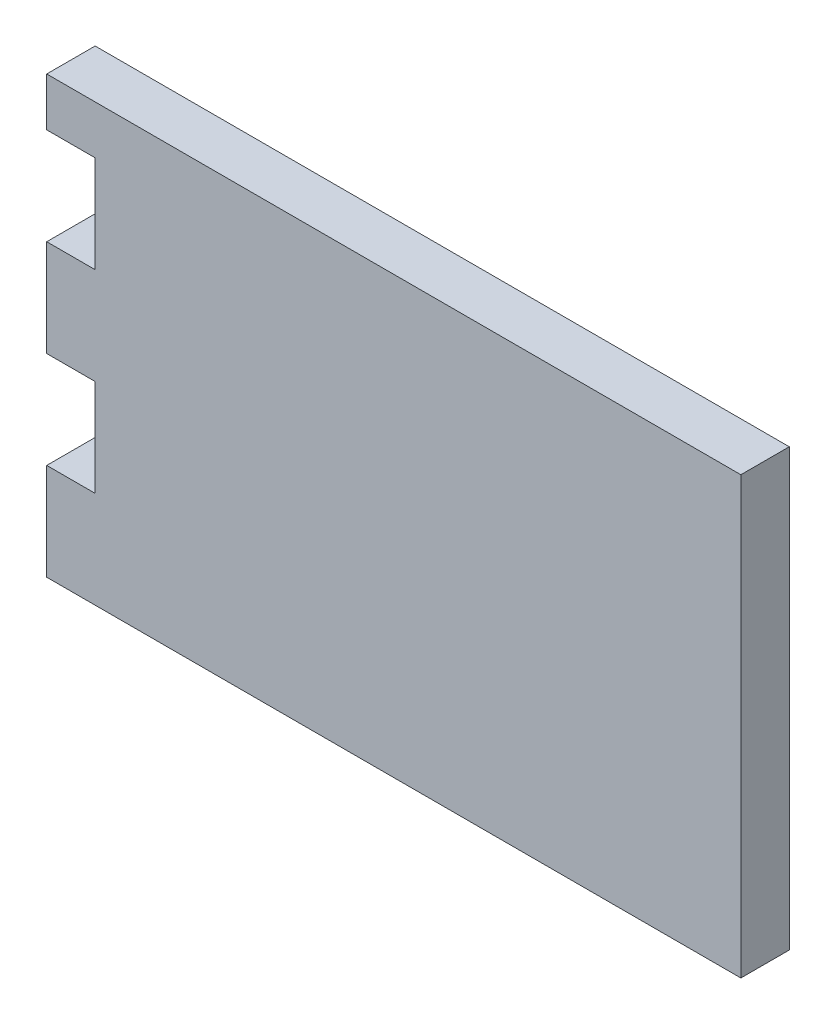
ISO-10303-21;
HEADER;
FILE_DESCRIPTION(('STEP AP214'),'2;1');
FILE_NAME('part.step','',(''),(''),'','','');
FILE_SCHEMA(('AUTOMOTIVE_DESIGN { 1 0 10303 214 1 1 1 1 }'));
ENDSEC;
DATA;
#1=APPLICATION_CONTEXT('core data for automotive mechanical design processes');
#2=APPLICATION_PROTOCOL_DEFINITION('international standard','automotive_design',2000,#1);
#3=PRODUCT_CONTEXT('',#1,'mechanical');
#4=PRODUCT('Part','Part','',(#3));
#5=PRODUCT_RELATED_PRODUCT_CATEGORY('part','',(#4));
#6=PRODUCT_DEFINITION_FORMATION('','',#4);
#7=PRODUCT_DEFINITION_CONTEXT('part definition',#1,'design');
#8=PRODUCT_DEFINITION('design','',#6,#7);
#9=PRODUCT_DEFINITION_SHAPE('','',#8);
#10=(LENGTH_UNIT() NAMED_UNIT(*) SI_UNIT(.MILLI.,.METRE.));
#11=(NAMED_UNIT(*) PLANE_ANGLE_UNIT() SI_UNIT($,.RADIAN.));
#12=(NAMED_UNIT(*) SI_UNIT($,.STERADIAN.) SOLID_ANGLE_UNIT());
#13=UNCERTAINTY_MEASURE_WITH_UNIT(LENGTH_MEASURE(1.E-05),#10,'distance_accuracy_value','');
#14=(GEOMETRIC_REPRESENTATION_CONTEXT(3) GLOBAL_UNCERTAINTY_ASSIGNED_CONTEXT((#13)) GLOBAL_UNIT_ASSIGNED_CONTEXT((#10,
#11,#12)) REPRESENTATION_CONTEXT('',''));
#15=CARTESIAN_POINT('',(0.,0.,0.));
#16=DIRECTION('',(0.,0.,1.));
#17=DIRECTION('',(1.,0.,0.));
#18=AXIS2_PLACEMENT_3D('',#15,#16,#17);
#19=CARTESIAN_POINT('',(0.,-18.,6.));
#20=DIRECTION('',(0.,1.,0.));
#21=DIRECTION('',(0.,0.,1.));
#22=AXIS2_PLACEMENT_3D('',#19,#20,#21);
#23=PLANE('',#22);
#24=DIRECTION('',(1.,0.,0.));
#25=VECTOR('',#24,1.);
#26=CARTESIAN_POINT('',(0.,-18.,0.));
#27=LINE('',#26,#25);
#28=CARTESIAN_POINT('',(0.,-18.,0.));
#29=VERTEX_POINT('',#28);
#30=CARTESIAN_POINT('',(5.99999999999984,-18.,0.));
#31=VERTEX_POINT('',#30);
#32=EDGE_CURVE('E166',#29,#31,#27,.T.);
#33=ORIENTED_EDGE('',*,*,#32,.F.);
#34=DIRECTION('',(0.,0.,-1.));
#35=VECTOR('',#34,1.);
#36=CARTESIAN_POINT('',(0.,-18.,6.));
#37=LINE('',#36,#35);
#38=CARTESIAN_POINT('',(0.,-18.,6.));
#39=VERTEX_POINT('',#38);
#40=EDGE_CURVE('E11',#39,#29,#37,.T.);
#41=ORIENTED_EDGE('',*,*,#40,.F.);
#42=DIRECTION('',(1.,0.,0.));
#43=VECTOR('',#42,1.);
#44=CARTESIAN_POINT('',(0.,-18.,6.));
#45=LINE('',#44,#43);
#46=CARTESIAN_POINT('',(5.99999999999984,-18.,6.));
#47=VERTEX_POINT('',#46);
#48=EDGE_CURVE('E202',#39,#47,#45,.T.);
#49=ORIENTED_EDGE('',*,*,#48,.T.);
#50=DIRECTION('',(0.,0.,-1.));
#51=VECTOR('',#50,1.);
#52=CARTESIAN_POINT('',(5.99999999999984,-18.,6.));
#53=LINE('',#52,#51);
#54=EDGE_CURVE('E105',#47,#31,#53,.T.);
#55=ORIENTED_EDGE('',*,*,#54,.T.);
#56=EDGE_LOOP('',(#33,#41,#49,#55));
#57=FACE_BOUND('',#56,.T.);
#58=ADVANCED_FACE('F41',(#57),#23,.T.);
#59=CARTESIAN_POINT('',(0.,0.,6.));
#60=DIRECTION('',(1.,0.,0.));
#61=DIRECTION('',(0.,1.,0.));
#62=AXIS2_PLACEMENT_3D('',#59,#60,#61);
#63=PLANE('',#62);
#64=DIRECTION('',(0.,-1.,0.));
#65=VECTOR('',#64,1.);
#66=CARTESIAN_POINT('',(0.,0.,0.));
#67=LINE('',#66,#65);
#68=CARTESIAN_POINT('',(0.,-30.,0.));
#69=VERTEX_POINT('',#68);
#70=EDGE_CURVE('E170',#29,#69,#67,.T.);
#71=ORIENTED_EDGE('',*,*,#70,.T.);
#72=DIRECTION('',(0.,0.,-1.));
#73=VECTOR('',#72,1.);
#74=CARTESIAN_POINT('',(0.,-30.,6.));
#75=LINE('',#74,#73);
#76=CARTESIAN_POINT('',(0.,-30.,6.));
#77=VERTEX_POINT('',#76);
#78=EDGE_CURVE('E50',#77,#69,#75,.T.);
#79=ORIENTED_EDGE('',*,*,#78,.F.);
#80=DIRECTION('',(0.,-1.,0.));
#81=VECTOR('',#80,1.);
#82=CARTESIAN_POINT('',(0.,0.,6.));
#83=LINE('',#82,#81);
#84=EDGE_CURVE('E149',#39,#77,#83,.T.);
#85=ORIENTED_EDGE('',*,*,#84,.F.);
#86=ORIENTED_EDGE('',*,*,#40,.T.);
#87=EDGE_LOOP('',(#71,#79,#85,#86));
#88=FACE_BOUND('',#87,.T.);
#89=ADVANCED_FACE('F288',(#88),#63,.F.);
#90=CARTESIAN_POINT('',(0.,-30.,6.));
#91=DIRECTION('',(0.,1.,0.));
#92=DIRECTION('',(0.,0.,1.));
#93=AXIS2_PLACEMENT_3D('',#90,#91,#92);
#94=PLANE('',#93);
#95=DIRECTION('',(1.,0.,0.));
#96=VECTOR('',#95,1.);
#97=CARTESIAN_POINT('',(0.,-30.,0.));
#98=LINE('',#97,#96);
#99=CARTESIAN_POINT('',(5.99999999999993,-30.,0.));
#100=VERTEX_POINT('',#99);
#101=EDGE_CURVE('E173',#69,#100,#98,.T.);
#102=ORIENTED_EDGE('',*,*,#101,.T.);
#103=DIRECTION('',(0.,0.,-1.));
#104=VECTOR('',#103,1.);
#105=CARTESIAN_POINT('',(5.99999999999993,-30.,6.));
#106=LINE('',#105,#104);
#107=CARTESIAN_POINT('',(5.99999999999993,-30.,6.));
#108=VERTEX_POINT('',#107);
#109=EDGE_CURVE('E225',#108,#100,#106,.T.);
#110=ORIENTED_EDGE('',*,*,#109,.F.);
#111=DIRECTION('',(1.,0.,0.));
#112=VECTOR('',#111,1.);
#113=CARTESIAN_POINT('',(0.,-30.,6.));
#114=LINE('',#113,#112);
#115=EDGE_CURVE('E236',#77,#108,#114,.T.);
#116=ORIENTED_EDGE('',*,*,#115,.F.);
#117=ORIENTED_EDGE('',*,*,#78,.T.);
#118=EDGE_LOOP('',(#102,#110,#116,#117));
#119=FACE_BOUND('',#118,.T.);
#120=ADVANCED_FACE('F234',(#119),#94,.F.);
#121=CARTESIAN_POINT('',(5.99999999999993,0.,6.));
#122=DIRECTION('',(1.,0.,0.));
#123=DIRECTION('',(0.,1.,0.));
#124=AXIS2_PLACEMENT_3D('',#121,#122,#123);
#125=PLANE('',#124);
#126=DIRECTION('',(0.,-1.,0.));
#127=VECTOR('',#126,1.);
#128=CARTESIAN_POINT('',(5.99999999999993,0.,0.));
#129=LINE('',#128,#127);
#130=CARTESIAN_POINT('',(5.99999999999992,-42.,0.));
#131=VERTEX_POINT('',#130);
#132=EDGE_CURVE('E177',#100,#131,#129,.T.);
#133=ORIENTED_EDGE('',*,*,#132,.T.);
#134=DIRECTION('',(0.,0.,-1.));
#135=VECTOR('',#134,1.);
#136=CARTESIAN_POINT('',(5.99999999999992,-42.,6.));
#137=LINE('',#136,#135);
#138=CARTESIAN_POINT('',(5.99999999999992,-42.,6.));
#139=VERTEX_POINT('',#138);
#140=EDGE_CURVE('E222',#139,#131,#137,.T.);
#141=ORIENTED_EDGE('',*,*,#140,.F.);
#142=DIRECTION('',(0.,-1.,0.));
#143=VECTOR('',#142,1.);
#144=CARTESIAN_POINT('',(5.99999999999993,0.,6.));
#145=LINE('',#144,#143);
#146=EDGE_CURVE('E249',#108,#139,#145,.T.);
#147=ORIENTED_EDGE('',*,*,#146,.F.);
#148=ORIENTED_EDGE('',*,*,#109,.T.);
#149=EDGE_LOOP('',(#133,#141,#147,#148));
#150=FACE_BOUND('',#149,.T.);
#151=ADVANCED_FACE('F246',(#150),#125,.F.);
#152=CARTESIAN_POINT('',(0.,-42.,6.));
#153=DIRECTION('',(0.,1.,0.));
#154=DIRECTION('',(0.,0.,1.));
#155=AXIS2_PLACEMENT_3D('',#152,#153,#154);
#156=PLANE('',#155);
#157=DIRECTION('',(1.,0.,0.));
#158=VECTOR('',#157,1.);
#159=CARTESIAN_POINT('',(0.,-42.,0.));
#160=LINE('',#159,#158);
#161=CARTESIAN_POINT('',(0.,-42.,0.));
#162=VERTEX_POINT('',#161);
#163=EDGE_CURVE('E181',#162,#131,#160,.T.);
#164=ORIENTED_EDGE('',*,*,#163,.F.);
#165=DIRECTION('',(0.,0.,-1.));
#166=VECTOR('',#165,1.);
#167=CARTESIAN_POINT('',(0.,-42.,6.));
#168=LINE('',#167,#166);
#169=CARTESIAN_POINT('',(0.,-42.,6.));
#170=VERTEX_POINT('',#169);
#171=EDGE_CURVE('E219',#170,#162,#168,.T.);
#172=ORIENTED_EDGE('',*,*,#171,.F.);
#173=DIRECTION('',(1.,0.,0.));
#174=VECTOR('',#173,1.);
#175=CARTESIAN_POINT('',(0.,-42.,6.));
#176=LINE('',#175,#174);
#177=EDGE_CURVE('E252',#170,#139,#176,.T.);
#178=ORIENTED_EDGE('',*,*,#177,.T.);
#179=ORIENTED_EDGE('',*,*,#140,.T.);
#180=EDGE_LOOP('',(#164,#172,#178,#179));
#181=FACE_BOUND('',#180,.T.);
#182=ADVANCED_FACE('F299',(#181),#156,.T.);
#183=CARTESIAN_POINT('',(0.,-54.,0.));
#184=VERTEX_POINT('',#183);
#185=EDGE_CURVE('E174',#162,#184,#67,.T.);
#186=ORIENTED_EDGE('',*,*,#185,.T.);
#187=DIRECTION('',(0.,0.,-1.));
#188=VECTOR('',#187,1.);
#189=CARTESIAN_POINT('',(0.,-54.,6.));
#190=LINE('',#189,#188);
#191=CARTESIAN_POINT('',(0.,-54.,6.));
#192=VERTEX_POINT('',#191);
#193=EDGE_CURVE('E215',#192,#184,#190,.T.);
#194=ORIENTED_EDGE('',*,*,#193,.F.);
#195=EDGE_CURVE('E148',#170,#192,#83,.T.);
#196=ORIENTED_EDGE('',*,*,#195,.F.);
#197=ORIENTED_EDGE('',*,*,#171,.T.);
#198=EDGE_LOOP('',(#186,#194,#196,#197));
#199=FACE_BOUND('',#198,.T.);
#200=ADVANCED_FACE('F275',(#199),#63,.F.);
#201=CARTESIAN_POINT('',(0.,-54.,6.));
#202=DIRECTION('',(0.,1.,0.));
#203=DIRECTION('',(0.,0.,1.));
#204=AXIS2_PLACEMENT_3D('',#201,#202,#203);
#205=PLANE('',#204);
#206=DIRECTION('',(1.,0.,0.));
#207=VECTOR('',#206,1.);
#208=CARTESIAN_POINT('',(0.,-54.,0.));
#209=LINE('',#208,#207);
#210=CARTESIAN_POINT('',(86.,-54.,0.));
#211=VERTEX_POINT('',#210);
#212=EDGE_CURVE('E185',#184,#211,#209,.T.);
#213=ORIENTED_EDGE('',*,*,#212,.T.);
#214=DIRECTION('',(0.,0.,-1.));
#215=VECTOR('',#214,1.);
#216=CARTESIAN_POINT('',(86.,-54.,6.));
#217=LINE('',#216,#215);
#218=CARTESIAN_POINT('',(86.,-54.,6.));
#219=VERTEX_POINT('',#218);
#220=EDGE_CURVE('E212',#219,#211,#217,.T.);
#221=ORIENTED_EDGE('',*,*,#220,.F.);
#222=DIRECTION('',(1.,0.,0.));
#223=VECTOR('',#222,1.);
#224=CARTESIAN_POINT('',(0.,-54.,6.));
#225=LINE('',#224,#223);
#226=EDGE_CURVE('E259',#192,#219,#225,.T.);
#227=ORIENTED_EDGE('',*,*,#226,.F.);
#228=ORIENTED_EDGE('',*,*,#193,.T.);
#229=EDGE_LOOP('',(#213,#221,#227,#228));
#230=FACE_BOUND('',#229,.T.);
#231=ADVANCED_FACE('F280',(#230),#205,.F.);
#232=CARTESIAN_POINT('',(86.,0.,6.));
#233=DIRECTION('',(1.,0.,0.));
#234=DIRECTION('',(0.,1.,0.));
#235=AXIS2_PLACEMENT_3D('',#232,#233,#234);
#236=PLANE('',#235);
#237=DIRECTION('',(0.,-1.,0.));
#238=VECTOR('',#237,1.);
#239=CARTESIAN_POINT('',(86.,0.,0.));
#240=LINE('',#239,#238);
#241=CARTESIAN_POINT('',(86.,0.,0.));
#242=VERTEX_POINT('',#241);
#243=EDGE_CURVE('E189',#242,#211,#240,.T.);
#244=ORIENTED_EDGE('',*,*,#243,.F.);
#245=DIRECTION('',(0.,0.,-1.));
#246=VECTOR('',#245,1.);
#247=CARTESIAN_POINT('',(86.,0.,6.));
#248=LINE('',#247,#246);
#249=CARTESIAN_POINT('',(86.,0.,6.));
#250=VERTEX_POINT('',#249);
#251=EDGE_CURVE('E209',#250,#242,#248,.T.);
#252=ORIENTED_EDGE('',*,*,#251,.F.);
#253=DIRECTION('',(0.,-1.,0.));
#254=VECTOR('',#253,1.);
#255=CARTESIAN_POINT('',(86.,0.,6.));
#256=LINE('',#255,#254);
#257=EDGE_CURVE('E261',#250,#219,#256,.T.);
#258=ORIENTED_EDGE('',*,*,#257,.T.);
#259=ORIENTED_EDGE('',*,*,#220,.T.);
#260=EDGE_LOOP('',(#244,#252,#258,#259));
#261=FACE_BOUND('',#260,.T.);
#262=ADVANCED_FACE('F282',(#261),#236,.T.);
#263=CARTESIAN_POINT('',(0.,0.,6.));
#264=DIRECTION('',(0.,1.,0.));
#265=DIRECTION('',(0.,0.,1.));
#266=AXIS2_PLACEMENT_3D('',#263,#264,#265);
#267=PLANE('',#266);
#268=DIRECTION('',(1.,0.,0.));
#269=VECTOR('',#268,1.);
#270=CARTESIAN_POINT('',(0.,0.,0.));
#271=LINE('',#270,#269);
#272=CARTESIAN_POINT('',(0.,0.,0.));
#273=VERTEX_POINT('',#272);
#274=EDGE_CURVE('E193',#273,#242,#271,.T.);
#275=ORIENTED_EDGE('',*,*,#274,.F.);
#276=DIRECTION('',(0.,0.,-1.));
#277=VECTOR('',#276,1.);
#278=CARTESIAN_POINT('',(0.,0.,6.));
#279=LINE('',#278,#277);
#280=CARTESIAN_POINT('',(0.,0.,6.));
#281=VERTEX_POINT('',#280);
#282=EDGE_CURVE('E155',#281,#273,#279,.T.);
#283=ORIENTED_EDGE('',*,*,#282,.F.);
#284=DIRECTION('',(1.,0.,0.));
#285=VECTOR('',#284,1.);
#286=CARTESIAN_POINT('',(0.,0.,6.));
#287=LINE('',#286,#285);
#288=EDGE_CURVE('E144',#281,#250,#287,.T.);
#289=ORIENTED_EDGE('',*,*,#288,.T.);
#290=ORIENTED_EDGE('',*,*,#251,.T.);
#291=EDGE_LOOP('',(#275,#283,#289,#290));
#292=FACE_BOUND('',#291,.T.);
#293=ADVANCED_FACE('F268',(#292),#267,.T.);
#294=CARTESIAN_POINT('',(0.,-6.,0.));
#295=VERTEX_POINT('',#294);
#296=EDGE_CURVE('E153',#273,#295,#67,.T.);
#297=ORIENTED_EDGE('',*,*,#296,.T.);
#298=DIRECTION('',(0.,0.,-1.));
#299=VECTOR('',#298,1.);
#300=CARTESIAN_POINT('',(0.,-6.,6.));
#301=LINE('',#300,#299);
#302=CARTESIAN_POINT('',(0.,-6.,6.));
#303=VERTEX_POINT('',#302);
#304=EDGE_CURVE('E150',#303,#295,#301,.T.);
#305=ORIENTED_EDGE('',*,*,#304,.F.);
#306=EDGE_CURVE('E137',#281,#303,#83,.T.);
#307=ORIENTED_EDGE('',*,*,#306,.F.);
#308=ORIENTED_EDGE('',*,*,#282,.T.);
#309=EDGE_LOOP('',(#297,#305,#307,#308));
#310=FACE_BOUND('',#309,.T.);
#311=ADVANCED_FACE('F151',(#310),#63,.F.);
#312=CARTESIAN_POINT('',(0.,-6.,6.));
#313=DIRECTION('',(0.,1.,0.));
#314=DIRECTION('',(0.,0.,1.));
#315=AXIS2_PLACEMENT_3D('',#312,#313,#314);
#316=PLANE('',#315);
#317=DIRECTION('',(1.,0.,0.));
#318=VECTOR('',#317,1.);
#319=CARTESIAN_POINT('',(0.,-6.,0.));
#320=LINE('',#319,#318);
#321=CARTESIAN_POINT('',(5.99999999999984,-6.,0.));
#322=VERTEX_POINT('',#321);
#323=EDGE_CURVE('E98',#295,#322,#320,.T.);
#324=ORIENTED_EDGE('',*,*,#323,.T.);
#325=DIRECTION('',(0.,0.,-1.));
#326=VECTOR('',#325,1.);
#327=CARTESIAN_POINT('',(5.99999999999984,-6.,6.));
#328=LINE('',#327,#326);
#329=CARTESIAN_POINT('',(5.99999999999984,-6.,6.));
#330=VERTEX_POINT('',#329);
#331=EDGE_CURVE('E156',#330,#322,#328,.T.);
#332=ORIENTED_EDGE('',*,*,#331,.F.);
#333=DIRECTION('',(1.,0.,0.));
#334=VECTOR('',#333,1.);
#335=CARTESIAN_POINT('',(0.,-6.,6.));
#336=LINE('',#335,#334);
#337=EDGE_CURVE('E141',#303,#330,#336,.T.);
#338=ORIENTED_EDGE('',*,*,#337,.F.);
#339=ORIENTED_EDGE('',*,*,#304,.T.);
#340=EDGE_LOOP('',(#324,#332,#338,#339));
#341=FACE_BOUND('',#340,.T.);
#342=ADVANCED_FACE('F158',(#341),#316,.F.);
#343=CARTESIAN_POINT('',(5.99999999999984,0.,6.));
#344=DIRECTION('',(1.,0.,0.));
#345=DIRECTION('',(0.,1.,0.));
#346=AXIS2_PLACEMENT_3D('',#343,#344,#345);
#347=PLANE('',#346);
#348=DIRECTION('',(0.,-1.,0.));
#349=VECTOR('',#348,1.);
#350=CARTESIAN_POINT('',(5.99999999999984,0.,0.));
#351=LINE('',#350,#349);
#352=EDGE_CURVE('E199',#322,#31,#351,.T.);
#353=ORIENTED_EDGE('',*,*,#352,.T.);
#354=ORIENTED_EDGE('',*,*,#54,.F.);
#355=DIRECTION('',(0.,-1.,0.));
#356=VECTOR('',#355,1.);
#357=CARTESIAN_POINT('',(5.99999999999984,0.,6.));
#358=LINE('',#357,#356);
#359=EDGE_CURVE('E58',#330,#47,#358,.T.);
#360=ORIENTED_EDGE('',*,*,#359,.F.);
#361=ORIENTED_EDGE('',*,*,#331,.T.);
#362=EDGE_LOOP('',(#353,#354,#360,#361));
#363=FACE_BOUND('',#362,.T.);
#364=ADVANCED_FACE('F305',(#363),#347,.F.);
#365=CARTESIAN_POINT('',(0.,0.,6.));
#366=DIRECTION('',(0.,0.,1.));
#367=DIRECTION('',(1.,0.,0.));
#368=AXIS2_PLACEMENT_3D('',#365,#366,#367);
#369=PLANE('',#368);
#370=ORIENTED_EDGE('',*,*,#48,.F.);
#371=ORIENTED_EDGE('',*,*,#84,.T.);
#372=ORIENTED_EDGE('',*,*,#115,.T.);
#373=ORIENTED_EDGE('',*,*,#146,.T.);
#374=ORIENTED_EDGE('',*,*,#177,.F.);
#375=ORIENTED_EDGE('',*,*,#195,.T.);
#376=ORIENTED_EDGE('',*,*,#226,.T.);
#377=ORIENTED_EDGE('',*,*,#257,.F.);
#378=ORIENTED_EDGE('',*,*,#288,.F.);
#379=ORIENTED_EDGE('',*,*,#306,.T.);
#380=ORIENTED_EDGE('',*,*,#337,.T.);
#381=ORIENTED_EDGE('',*,*,#359,.T.);
#382=EDGE_LOOP('',(#370,#371,#372,#373,#374,#375,#376,#377,#378,#379,#380,#381));
#383=FACE_BOUND('',#382,.T.);
#384=ADVANCED_FACE('F139',(#383),#369,.T.);
#385=CARTESIAN_POINT('',(0.,0.,0.));
#386=DIRECTION('',(0.,0.,1.));
#387=DIRECTION('',(1.,0.,0.));
#388=AXIS2_PLACEMENT_3D('',#385,#386,#387);
#389=PLANE('',#388);
#390=ORIENTED_EDGE('',*,*,#32,.T.);
#391=ORIENTED_EDGE('',*,*,#352,.F.);
#392=ORIENTED_EDGE('',*,*,#323,.F.);
#393=ORIENTED_EDGE('',*,*,#296,.F.);
#394=ORIENTED_EDGE('',*,*,#274,.T.);
#395=ORIENTED_EDGE('',*,*,#243,.T.);
#396=ORIENTED_EDGE('',*,*,#212,.F.);
#397=ORIENTED_EDGE('',*,*,#185,.F.);
#398=ORIENTED_EDGE('',*,*,#163,.T.);
#399=ORIENTED_EDGE('',*,*,#132,.F.);
#400=ORIENTED_EDGE('',*,*,#101,.F.);
#401=ORIENTED_EDGE('',*,*,#70,.F.);
#402=EDGE_LOOP('',(#390,#391,#392,#393,#394,#395,#396,#397,#398,#399,#400,#401));
#403=FACE_BOUND('',#402,.T.);
#404=ADVANCED_FACE('F241',(#403),#389,.F.);
#405=CLOSED_SHELL('',(#58,#89,#120,#151,#182,#200,#231,#262,#293,#311,#342,#364,#384,#404));
#406=MANIFOLD_SOLID_BREP('B2',#405);
#407=ADVANCED_BREP_SHAPE_REPRESENTATION('',(#18,#406),#14);
#408=SHAPE_DEFINITION_REPRESENTATION(#9,#407);
ENDSEC;
END-ISO-10303-21;
